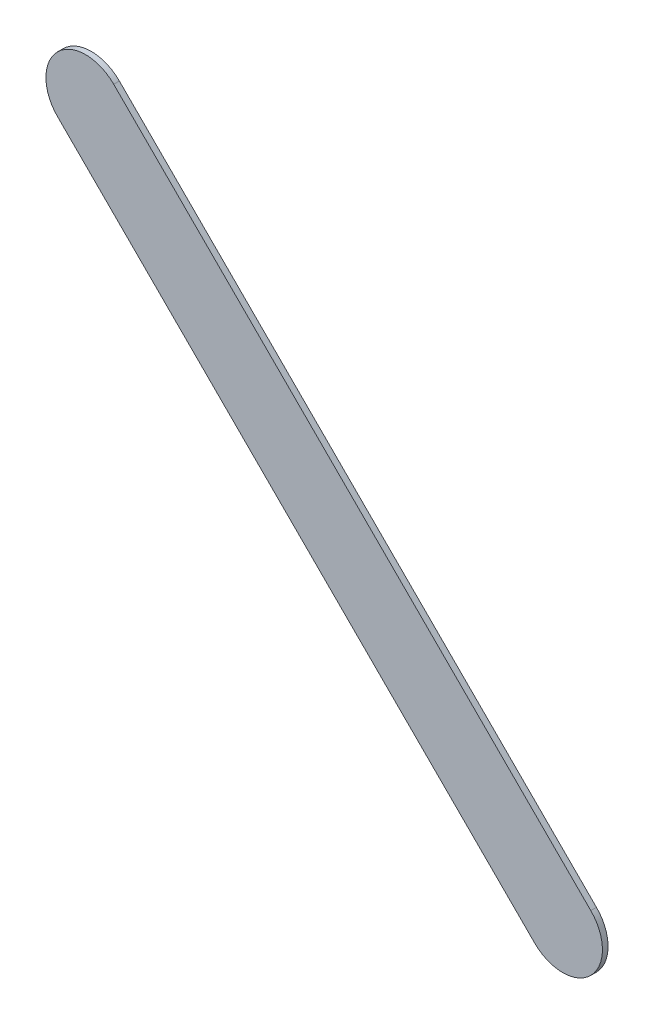
ISO-10303-21;
HEADER;
FILE_DESCRIPTION(('STEP AP214'),'2;1');
FILE_NAME('part.step','',(''),(''),'','','');
FILE_SCHEMA(('AUTOMOTIVE_DESIGN { 1 0 10303 214 1 1 1 1 }'));
ENDSEC;
DATA;
#1=APPLICATION_CONTEXT('core data for automotive mechanical design processes');
#2=APPLICATION_PROTOCOL_DEFINITION('international standard','automotive_design',2000,#1);
#3=PRODUCT_CONTEXT('',#1,'mechanical');
#4=PRODUCT('Part','Part','',(#3));
#5=PRODUCT_RELATED_PRODUCT_CATEGORY('part','',(#4));
#6=PRODUCT_DEFINITION_FORMATION('','',#4);
#7=PRODUCT_DEFINITION_CONTEXT('part definition',#1,'design');
#8=PRODUCT_DEFINITION('design','',#6,#7);
#9=PRODUCT_DEFINITION_SHAPE('','',#8);
#10=(LENGTH_UNIT() NAMED_UNIT(*) SI_UNIT(.MILLI.,.METRE.));
#11=(NAMED_UNIT(*) PLANE_ANGLE_UNIT() SI_UNIT($,.RADIAN.));
#12=(NAMED_UNIT(*) SI_UNIT($,.STERADIAN.) SOLID_ANGLE_UNIT());
#13=UNCERTAINTY_MEASURE_WITH_UNIT(LENGTH_MEASURE(1.E-05),#10,'distance_accuracy_value','');
#14=(GEOMETRIC_REPRESENTATION_CONTEXT(3) GLOBAL_UNCERTAINTY_ASSIGNED_CONTEXT((#13)) GLOBAL_UNIT_ASSIGNED_CONTEXT((#10,
#11,#12)) REPRESENTATION_CONTEXT('',''));
#15=CARTESIAN_POINT('',(0.,0.,0.));
#16=DIRECTION('',(0.,0.,1.));
#17=DIRECTION('',(1.,0.,0.));
#18=AXIS2_PLACEMENT_3D('',#15,#16,#17);
#19=CARTESIAN_POINT('',(52.48222676,75.13053554,0.));
#20=DIRECTION('',(0.707106781186549,0.707106781186547,0.));
#21=DIRECTION('',(0.707106781186547,-0.707106781186549,0.));
#22=AXIS2_PLACEMENT_3D('',#19,#20,#21);
#23=PLANE('',#22);
#24=DIRECTION('',(0.707106781186547,-0.707106781186549,0.));
#25=VECTOR('',#24,1.);
#26=CARTESIAN_POINT('',(52.48222676,75.13053554,0.03556));
#27=LINE('',#26,#25);
#28=CARTESIAN_POINT('',(52.48222676,75.13053554,0.03556));
#29=VERTEX_POINT('',#28);
#30=CARTESIAN_POINT('',(55.48609426,72.12666804,0.03556));
#31=VERTEX_POINT('',#30);
#32=EDGE_CURVE('E11',#29,#31,#27,.T.);
#33=ORIENTED_EDGE('',*,*,#32,.F.);
#34=DIRECTION('',(0.,0.,1.));
#35=VECTOR('',#34,1.);
#36=CARTESIAN_POINT('',(52.48222676,75.13053554,0.));
#37=LINE('',#36,#35);
#38=CARTESIAN_POINT('',(52.48222676,75.13053554,0.));
#39=VERTEX_POINT('',#38);
#40=EDGE_CURVE('E24',#39,#29,#37,.T.);
#41=ORIENTED_EDGE('',*,*,#40,.F.);
#42=DIRECTION('',(0.707106781186547,-0.707106781186549,0.));
#43=VECTOR('',#42,1.);
#44=CARTESIAN_POINT('',(52.48222676,75.13053554,0.));
#45=LINE('',#44,#43);
#46=CARTESIAN_POINT('',(55.48609426,72.12666804,0.));
#47=VERTEX_POINT('',#46);
#48=EDGE_CURVE('E75',#39,#47,#45,.T.);
#49=ORIENTED_EDGE('',*,*,#48,.T.);
#50=DIRECTION('',(0.,0.,1.));
#51=VECTOR('',#50,1.);
#52=CARTESIAN_POINT('',(55.48609426,72.12666804,0.));
#53=LINE('',#52,#51);
#54=EDGE_CURVE('E37',#47,#31,#53,.T.);
#55=ORIENTED_EDGE('',*,*,#54,.T.);
#56=EDGE_LOOP('',(#33,#41,#49,#55));
#57=FACE_BOUND('',#56,.T.);
#58=ADVANCED_FACE('F17',(#57),#23,.F.);
#59=CARTESIAN_POINT('',(55.66287064,72.30344442,0.));
#60=DIRECTION('',(0.,0.,-1.));
#61=DIRECTION('',(-0.707106781186533,-0.707106781186562,0.));
#62=AXIS2_PLACEMENT_3D('',#59,#60,#61);
#63=CYLINDRICAL_SURFACE('',#62,0.249999554103225);
#64=CARTESIAN_POINT('',(55.66287064,72.30344442,0.03556));
#65=DIRECTION('',(0.,0.,1.));
#66=DIRECTION('',(-0.707106781186533,-0.707106781186562,0.));
#67=AXIS2_PLACEMENT_3D('',#64,#65,#66);
#68=CIRCLE('',#67,0.249999554103225);
#69=CARTESIAN_POINT('',(55.83964702,72.4802208,0.03556));
#70=VERTEX_POINT('',#69);
#71=EDGE_CURVE('E83',#31,#70,#68,.T.);
#72=ORIENTED_EDGE('',*,*,#71,.F.);
#73=ORIENTED_EDGE('',*,*,#54,.F.);
#74=CARTESIAN_POINT('',(55.66287064,72.30344442,0.));
#75=DIRECTION('',(0.,0.,1.));
#76=DIRECTION('',(-0.707106781186533,-0.707106781186562,0.));
#77=AXIS2_PLACEMENT_3D('',#74,#75,#76);
#78=CIRCLE('',#77,0.249999554103225);
#79=CARTESIAN_POINT('',(55.83964702,72.4802208,0.));
#80=VERTEX_POINT('',#79);
#81=EDGE_CURVE('E81',#47,#80,#78,.T.);
#82=ORIENTED_EDGE('',*,*,#81,.T.);
#83=DIRECTION('',(0.,0.,1.));
#84=VECTOR('',#83,1.);
#85=CARTESIAN_POINT('',(55.83964702,72.4802208,0.));
#86=LINE('',#85,#84);
#87=EDGE_CURVE('E67',#80,#70,#86,.T.);
#88=ORIENTED_EDGE('',*,*,#87,.T.);
#89=EDGE_LOOP('',(#72,#73,#82,#88));
#90=FACE_BOUND('',#89,.T.);
#91=ADVANCED_FACE('F89',(#90),#63,.T.);
#92=CARTESIAN_POINT('',(55.83964702,72.4802208,0.));
#93=DIRECTION('',(-0.707106781186547,-0.707106781186548,0.));
#94=DIRECTION('',(-0.707106781186548,0.707106781186547,0.));
#95=AXIS2_PLACEMENT_3D('',#92,#93,#94);
#96=PLANE('',#95);
#97=DIRECTION('',(-0.707106781186548,0.707106781186547,0.));
#98=VECTOR('',#97,1.);
#99=CARTESIAN_POINT('',(55.83964702,72.4802208,0.03556));
#100=LINE('',#99,#98);
#101=CARTESIAN_POINT('',(52.83577952,75.4840883,0.03556));
#102=VERTEX_POINT('',#101);
#103=EDGE_CURVE('E71',#70,#102,#100,.T.);
#104=ORIENTED_EDGE('',*,*,#103,.F.);
#105=ORIENTED_EDGE('',*,*,#87,.F.);
#106=DIRECTION('',(-0.707106781186548,0.707106781186547,0.));
#107=VECTOR('',#106,1.);
#108=CARTESIAN_POINT('',(55.83964702,72.4802208,0.));
#109=LINE('',#108,#107);
#110=CARTESIAN_POINT('',(52.83577952,75.4840883,0.));
#111=VERTEX_POINT('',#110);
#112=EDGE_CURVE('E63',#80,#111,#109,.T.);
#113=ORIENTED_EDGE('',*,*,#112,.T.);
#114=DIRECTION('',(0.,0.,1.));
#115=VECTOR('',#114,1.);
#116=CARTESIAN_POINT('',(52.83577952,75.4840883,0.));
#117=LINE('',#116,#115);
#118=EDGE_CURVE('E53',#111,#102,#117,.T.);
#119=ORIENTED_EDGE('',*,*,#118,.T.);
#120=EDGE_LOOP('',(#104,#105,#113,#119));
#121=FACE_BOUND('',#120,.T.);
#122=ADVANCED_FACE('F66',(#121),#96,.F.);
#123=CARTESIAN_POINT('',(52.65900314,75.30731192,0.));
#124=DIRECTION('',(0.,0.,-1.));
#125=DIRECTION('',(0.707106781186533,0.707106781186562,0.));
#126=AXIS2_PLACEMENT_3D('',#123,#124,#125);
#127=CYLINDRICAL_SURFACE('',#126,0.249999554103218);
#128=CARTESIAN_POINT('',(52.65900314,75.30731192,0.03556));
#129=DIRECTION('',(0.,0.,1.));
#130=DIRECTION('',(0.707106781186533,0.707106781186562,0.));
#131=AXIS2_PLACEMENT_3D('',#128,#129,#130);
#132=CIRCLE('',#131,0.249999554103218);
#133=EDGE_CURVE('E59',#102,#29,#132,.T.);
#134=ORIENTED_EDGE('',*,*,#133,.F.);
#135=ORIENTED_EDGE('',*,*,#118,.F.);
#136=CARTESIAN_POINT('',(52.65900314,75.30731192,0.));
#137=DIRECTION('',(0.,0.,1.));
#138=DIRECTION('',(0.707106781186533,0.707106781186562,0.));
#139=AXIS2_PLACEMENT_3D('',#136,#137,#138);
#140=CIRCLE('',#139,0.249999554103218);
#141=EDGE_CURVE('E57',#111,#39,#140,.T.);
#142=ORIENTED_EDGE('',*,*,#141,.T.);
#143=ORIENTED_EDGE('',*,*,#40,.T.);
#144=EDGE_LOOP('',(#134,#135,#142,#143));
#145=FACE_BOUND('',#144,.T.);
#146=ADVANCED_FACE('F55',(#145),#127,.T.);
#147=CARTESIAN_POINT('',(52.48222676,75.13053554,0.));
#148=DIRECTION('',(0.,0.,-1.));
#149=DIRECTION('',(-1.,0.,0.));
#150=AXIS2_PLACEMENT_3D('',#147,#148,#149);
#151=PLANE('',#150);
#152=ORIENTED_EDGE('',*,*,#141,.F.);
#153=ORIENTED_EDGE('',*,*,#112,.F.);
#154=ORIENTED_EDGE('',*,*,#81,.F.);
#155=ORIENTED_EDGE('',*,*,#48,.F.);
#156=EDGE_LOOP('',(#152,#153,#154,#155));
#157=FACE_BOUND('',#156,.T.);
#158=ADVANCED_FACE('F74',(#157),#151,.T.);
#159=CARTESIAN_POINT('',(52.48222676,75.13053554,0.03556));
#160=DIRECTION('',(0.,0.,-1.));
#161=DIRECTION('',(-1.,0.,0.));
#162=AXIS2_PLACEMENT_3D('',#159,#160,#161);
#163=PLANE('',#162);
#164=ORIENTED_EDGE('',*,*,#32,.T.);
#165=ORIENTED_EDGE('',*,*,#71,.T.);
#166=ORIENTED_EDGE('',*,*,#103,.T.);
#167=ORIENTED_EDGE('',*,*,#133,.T.);
#168=EDGE_LOOP('',(#164,#165,#166,#167));
#169=FACE_BOUND('',#168,.T.);
#170=ADVANCED_FACE('F91',(#169),#163,.F.);
#171=CLOSED_SHELL('',(#58,#91,#122,#146,#158,#170));
#172=MANIFOLD_SOLID_BREP('B1',#171);
#173=ADVANCED_BREP_SHAPE_REPRESENTATION('',(#18,#172),#14);
#174=SHAPE_DEFINITION_REPRESENTATION(#9,#173);
ENDSEC;
END-ISO-10303-21;
